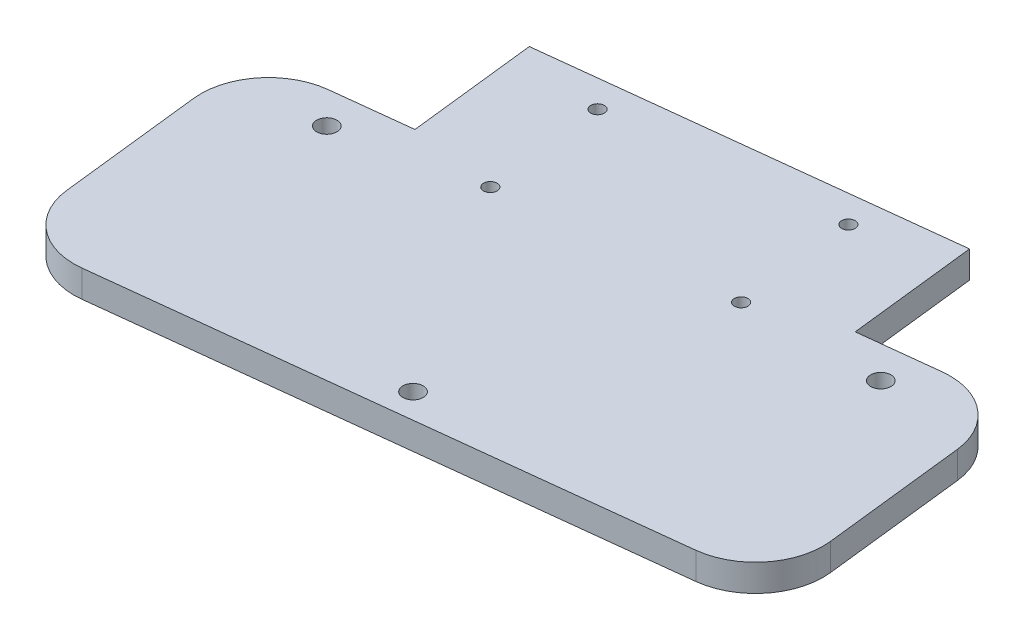
ISO-10303-21;
HEADER;
FILE_DESCRIPTION(('STEP AP214'),'2;1');
FILE_NAME('part.step','',(''),(''),'','','');
FILE_SCHEMA(('AUTOMOTIVE_DESIGN { 1 0 10303 214 1 1 1 1 }'));
ENDSEC;
DATA;
#1=APPLICATION_CONTEXT('core data for automotive mechanical design processes');
#2=APPLICATION_PROTOCOL_DEFINITION('international standard','automotive_design',2000,#1);
#3=PRODUCT_CONTEXT('',#1,'mechanical');
#4=PRODUCT('Part','Part','',(#3));
#5=PRODUCT_RELATED_PRODUCT_CATEGORY('part','',(#4));
#6=PRODUCT_DEFINITION_FORMATION('','',#4);
#7=PRODUCT_DEFINITION_CONTEXT('part definition',#1,'design');
#8=PRODUCT_DEFINITION('design','',#6,#7);
#9=PRODUCT_DEFINITION_SHAPE('','',#8);
#10=(LENGTH_UNIT() NAMED_UNIT(*) SI_UNIT(.MILLI.,.METRE.));
#11=(NAMED_UNIT(*) PLANE_ANGLE_UNIT() SI_UNIT($,.RADIAN.));
#12=(NAMED_UNIT(*) SI_UNIT($,.STERADIAN.) SOLID_ANGLE_UNIT());
#13=UNCERTAINTY_MEASURE_WITH_UNIT(LENGTH_MEASURE(1.E-05),#10,'distance_accuracy_value','');
#14=(GEOMETRIC_REPRESENTATION_CONTEXT(3) GLOBAL_UNCERTAINTY_ASSIGNED_CONTEXT((#13)) GLOBAL_UNIT_ASSIGNED_CONTEXT((#10,
#11,#12)) REPRESENTATION_CONTEXT('',''));
#15=CARTESIAN_POINT('',(0.,0.,0.));
#16=DIRECTION('',(0.,0.,1.));
#17=DIRECTION('',(1.,0.,0.));
#18=AXIS2_PLACEMENT_3D('',#15,#16,#17);
#19=CARTESIAN_POINT('',(0.,4.,0.));
#20=DIRECTION('',(0.,-1.,0.));
#21=DIRECTION('',(0.,0.,-1.));
#22=AXIS2_PLACEMENT_3D('',#19,#20,#21);
#23=PLANE('',#22);
#24=DIRECTION('',(-0.993623352764833,0.,0.112750311930262));
#25=VECTOR('',#24,1.);
#26=CARTESIAN_POINT('',(-43.5958037661953,4.,205.807188303606));
#27=LINE('',#26,#25);
#28=CARTESIAN_POINT('',(-22.1351096812922,4.,203.37195975792));
#29=VERTEX_POINT('',#28);
#30=CARTESIAN_POINT('',(-33.6595702385469,4.,204.679685184303));
#31=VERTEX_POINT('',#30);
#32=EDGE_CURVE('E156',#29,#31,#27,.T.);
#33=ORIENTED_EDGE('',*,*,#32,.T.);
#34=CARTESIAN_POINT('',(-32.5320671192443,4.,214.615918711952));
#35=DIRECTION('',(0.,-1.,0.));
#36=DIRECTION('',(0.,0.,-1.));
#37=AXIS2_PLACEMENT_3D('',#34,#35,#36);
#38=CIRCLE('',#37,10.);
#39=CARTESIAN_POINT('',(-42.4683006468926,4.,215.743421831254));
#40=VERTEX_POINT('',#39);
#41=EDGE_CURVE('E11',#31,#40,#38,.F.);
#42=ORIENTED_EDGE('',*,*,#41,.T.);
#43=DIRECTION('',(0.112750311930262,0.,0.993623352764833));
#44=VECTOR('',#43,1.);
#45=CARTESIAN_POINT('',(-38.93970222805,4.,246.839546812795));
#46=LINE('',#45,#44);
#47=CARTESIAN_POINT('',(-40.0672053473526,4.,236.903313285147));
#48=VERTEX_POINT('',#47);
#49=EDGE_CURVE('E177',#40,#48,#46,.T.);
#50=ORIENTED_EDGE('',*,*,#49,.T.);
#51=CARTESIAN_POINT('',(-30.1309718197043,4.,235.775810165844));
#52=DIRECTION('',(0.,-1.,0.));
#53=DIRECTION('',(0.,0.,-1.));
#54=AXIS2_PLACEMENT_3D('',#51,#52,#53);
#55=CIRCLE('',#54,10.);
#56=CARTESIAN_POINT('',(-29.0034687004016,4.,245.712043693493));
#57=VERTEX_POINT('',#56);
#58=EDGE_CURVE('E192',#48,#57,#55,.F.);
#59=ORIENTED_EDGE('',*,*,#58,.T.);
#60=DIRECTION('',(0.993623352764833,0.,-0.112750311930262));
#61=VECTOR('',#60,1.);
#62=CARTESIAN_POINT('',(62.4098797539631,4.,235.339014995908));
#63=LINE('',#62,#61);
#64=CARTESIAN_POINT('',(52.4736462263148,4.,236.466518115211));
#65=VERTEX_POINT('',#64);
#66=EDGE_CURVE('E229',#57,#65,#63,.T.);
#67=ORIENTED_EDGE('',*,*,#66,.T.);
#68=CARTESIAN_POINT('',(51.3461431070122,4.,226.530284587563));
#69=DIRECTION('',(0.,-1.,0.));
#70=DIRECTION('',(0.,0.,-1.));
#71=AXIS2_PLACEMENT_3D('',#68,#69,#70);
#72=CIRCLE('',#71,10.);
#73=CARTESIAN_POINT('',(61.2823766346605,4.,225.40278146826));
#74=VERTEX_POINT('',#73);
#75=EDGE_CURVE('E201',#65,#74,#72,.F.);
#76=ORIENTED_EDGE('',*,*,#75,.T.);
#77=DIRECTION('',(-0.112750311930261,0.,-0.993623352764834));
#78=VECTOR('',#77,1.);
#79=CARTESIAN_POINT('',(57.7537782158178,4.,194.306656486719));
#80=LINE('',#79,#78);
#81=CARTESIAN_POINT('',(58.8812813351205,4.,204.242890014368));
#82=VERTEX_POINT('',#81);
#83=EDGE_CURVE('E134',#74,#82,#80,.T.);
#84=ORIENTED_EDGE('',*,*,#83,.T.);
#85=CARTESIAN_POINT('',(48.9450478074721,4.,205.37039313367));
#86=DIRECTION('',(0.,-1.,0.));
#87=DIRECTION('',(0.,0.,-1.));
#88=AXIS2_PLACEMENT_3D('',#85,#86,#87);
#89=CIRCLE('',#88,10.);
#90=CARTESIAN_POINT('',(47.8175446881695,4.,195.434159606022));
#91=VERTEX_POINT('',#90);
#92=EDGE_CURVE('E130',#82,#91,#89,.F.);
#93=ORIENTED_EDGE('',*,*,#92,.T.);
#94=DIRECTION('',(-0.993623352764833,0.,0.112750311930262));
#95=VECTOR('',#94,1.);
#96=CARTESIAN_POINT('',(36.2930841309148,4.,196.741885032405));
#97=LINE('',#96,#95);
#98=CARTESIAN_POINT('',(36.2930841309148,4.,196.741885032405));
#99=VERTEX_POINT('',#98);
#100=EDGE_CURVE('E122',#91,#99,#97,.T.);
#101=ORIENTED_EDGE('',*,*,#100,.T.);
#102=DIRECTION('',(-0.112750311930261,0.,-0.993623352764833));
#103=VECTOR('',#102,1.);
#104=CARTESIAN_POINT('',(34.1301854770655,4.,177.681125240826));
#105=LINE('',#104,#103);
#106=CARTESIAN_POINT('',(34.1301854770655,4.,177.681125240826));
#107=VERTEX_POINT('',#106);
#108=EDGE_CURVE('E126',#99,#107,#105,.T.);
#109=ORIENTED_EDGE('',*,*,#108,.T.);
#110=DIRECTION('',(-0.993623352764833,0.,0.112750311930262));
#111=VECTOR('',#110,1.);
#112=CARTESIAN_POINT('',(-24.2980083351415,4.,184.311199966341));
#113=LINE('',#112,#111);
#114=CARTESIAN_POINT('',(-24.2980083351415,4.,184.311199966341));
#115=VERTEX_POINT('',#114);
#116=EDGE_CURVE('E149',#107,#115,#113,.T.);
#117=ORIENTED_EDGE('',*,*,#116,.T.);
#118=DIRECTION('',(0.112750311930262,0.,0.993623352764834));
#119=VECTOR('',#118,1.);
#120=CARTESIAN_POINT('',(-22.1351096812922,4.,203.37195975792));
#121=LINE('',#120,#119);
#122=EDGE_CURVE('E151',#115,#29,#121,.T.);
#123=ORIENTED_EDGE('',*,*,#122,.T.);
#124=EDGE_LOOP('',(#33,#42,#50,#59,#67,#76,#84,#93,#101,#109,#117,#123));
#125=FACE_BOUND('',#124,.T.);
#126=CARTESIAN_POINT('',(-29.0931407132156,4.,209.44517989492));
#127=DIRECTION('',(0.,1.,0.));
#128=DIRECTION('',(0.,0.,1.));
#129=AXIS2_PLACEMENT_3D('',#126,#127,#128);
#130=CIRCLE('',#129,1.5);
#131=CARTESIAN_POINT('',(-29.0931407132156,4.,210.94517989492));
#132=VERTEX_POINT('',#131);
#133=EDGE_CURVE('E162',#132,#132,#130,.T.);
#134=ORIENTED_EDGE('',*,*,#133,.F.);
#135=EDGE_LOOP('',(#134));
#136=FACE_BOUND('',#135,.T.);
#137=CARTESIAN_POINT('',(44.4349873913821,4.,201.101656812081));
#138=DIRECTION('',(0.,1.,0.));
#139=DIRECTION('',(0.,0.,-1.));
#140=AXIS2_PLACEMENT_3D('',#137,#138,#139);
#141=CIRCLE('',#140,1.5);
#142=CARTESIAN_POINT('',(44.4349873913821,4.,199.601656812081));
#143=VERTEX_POINT('',#142);
#144=EDGE_CURVE('E240',#143,#143,#141,.T.);
#145=ORIENTED_EDGE('',*,*,#144,.F.);
#146=EDGE_LOOP('',(#145));
#147=FACE_BOUND('',#146,.T.);
#148=CARTESIAN_POINT('',(11.2789333208517,4.,237.069365641975));
#149=DIRECTION('',(0.,1.,0.));
#150=DIRECTION('',(0.,0.,1.));
#151=AXIS2_PLACEMENT_3D('',#148,#149,#150);
#152=CIRCLE('',#151,1.5);
#153=CARTESIAN_POINT('',(11.2789333208517,4.,238.569365641975));
#154=VERTEX_POINT('',#153);
#155=EDGE_CURVE('E246',#154,#154,#152,.T.);
#156=ORIENTED_EDGE('',*,*,#155,.F.);
#157=EDGE_LOOP('',(#156));
#158=FACE_BOUND('',#157,.T.);
#159=CARTESIAN_POINT('',(-9.19776844358822,4.,205.174739372802));
#160=DIRECTION('',(0.,1.,0.));
#161=DIRECTION('',(0.,0.,1.));
#162=AXIS2_PLACEMENT_3D('',#159,#160,#161);
#163=CIRCLE('',#162,1.);
#164=CARTESIAN_POINT('',(-9.19776844358822,4.,206.174739372802));
#165=VERTEX_POINT('',#164);
#166=EDGE_CURVE('E252',#165,#165,#163,.T.);
#167=ORIENTED_EDGE('',*,*,#166,.F.);
#168=EDGE_LOOP('',(#167));
#169=FACE_BOUND('',#168,.T.);
#170=CARTESIAN_POINT('',(-11.2267660300873,4.,187.293996072545));
#171=DIRECTION('',(0.,1.,0.));
#172=DIRECTION('',(0.,0.,1.));
#173=AXIS2_PLACEMENT_3D('',#170,#171,#172);
#174=CIRCLE('',#173,1.);
#175=CARTESIAN_POINT('',(-11.2267660300873,4.,188.293996072545));
#176=VERTEX_POINT('',#175);
#177=EDGE_CURVE('E258',#176,#176,#174,.T.);
#178=ORIENTED_EDGE('',*,*,#177,.F.);
#179=EDGE_LOOP('',(#178));
#180=FACE_BOUND('',#179,.T.);
#181=CARTESIAN_POINT('',(22.0596162875347,4.,183.516860622882));
#182=DIRECTION('',(0.,1.,0.));
#183=DIRECTION('',(0.,0.,1.));
#184=AXIS2_PLACEMENT_3D('',#181,#182,#183);
#185=CIRCLE('',#184,0.999999999999992);
#186=CARTESIAN_POINT('',(22.0596162875347,4.,184.516860622882));
#187=VERTEX_POINT('',#186);
#188=EDGE_CURVE('E264',#187,#187,#185,.T.);
#189=ORIENTED_EDGE('',*,*,#188,.F.);
#190=EDGE_LOOP('',(#189));
#191=FACE_BOUND('',#190,.T.);
#192=CARTESIAN_POINT('',(24.0886138740337,4.,201.397603923139));
#193=DIRECTION('',(0.,1.,0.));
#194=DIRECTION('',(0.,0.,1.));
#195=AXIS2_PLACEMENT_3D('',#192,#193,#194);
#196=CIRCLE('',#195,0.999999999999992);
#197=CARTESIAN_POINT('',(24.0886138740337,4.,202.397603923139));
#198=VERTEX_POINT('',#197);
#199=EDGE_CURVE('E270',#198,#198,#196,.T.);
#200=ORIENTED_EDGE('',*,*,#199,.F.);
#201=EDGE_LOOP('',(#200));
#202=FACE_BOUND('',#201,.T.);
#203=ADVANCED_FACE('F34',(#125,#136,#147,#158,#169,#180,#191,#202),#23,.F.);
#204=CARTESIAN_POINT('',(0.,0.,0.));
#205=DIRECTION('',(0.,-1.,0.));
#206=DIRECTION('',(0.,0.,-1.));
#207=AXIS2_PLACEMENT_3D('',#204,#205,#206);
#208=PLANE('',#207);
#209=CARTESIAN_POINT('',(22.0596162875347,0.,183.516860622882));
#210=DIRECTION('',(0.,1.,0.));
#211=DIRECTION('',(0.,0.,1.));
#212=AXIS2_PLACEMENT_3D('',#209,#210,#211);
#213=CIRCLE('',#212,0.999999999999992);
#214=CARTESIAN_POINT('',(22.0596162875347,0.,184.516860622882));
#215=VERTEX_POINT('',#214);
#216=EDGE_CURVE('E267',#215,#215,#213,.T.);
#217=ORIENTED_EDGE('',*,*,#216,.T.);
#218=EDGE_LOOP('',(#217));
#219=FACE_BOUND('',#218,.T.);
#220=CARTESIAN_POINT('',(-9.19776844358822,0.,205.174739372802));
#221=DIRECTION('',(0.,1.,0.));
#222=DIRECTION('',(0.,0.,1.));
#223=AXIS2_PLACEMENT_3D('',#220,#221,#222);
#224=CIRCLE('',#223,1.);
#225=CARTESIAN_POINT('',(-9.19776844358822,0.,206.174739372802));
#226=VERTEX_POINT('',#225);
#227=EDGE_CURVE('E255',#226,#226,#224,.T.);
#228=ORIENTED_EDGE('',*,*,#227,.T.);
#229=EDGE_LOOP('',(#228));
#230=FACE_BOUND('',#229,.T.);
#231=CARTESIAN_POINT('',(44.4349873913821,0.,201.101656812081));
#232=DIRECTION('',(0.,1.,0.));
#233=DIRECTION('',(0.,0.,-1.));
#234=AXIS2_PLACEMENT_3D('',#231,#232,#233);
#235=CIRCLE('',#234,1.5);
#236=CARTESIAN_POINT('',(44.4349873913821,0.,199.601656812081));
#237=VERTEX_POINT('',#236);
#238=EDGE_CURVE('E243',#237,#237,#235,.T.);
#239=ORIENTED_EDGE('',*,*,#238,.T.);
#240=EDGE_LOOP('',(#239));
#241=FACE_BOUND('',#240,.T.);
#242=DIRECTION('',(0.112750311930262,0.,0.993623352764833));
#243=VECTOR('',#242,1.);
#244=CARTESIAN_POINT('',(-38.93970222805,0.,246.839546812795));
#245=LINE('',#244,#243);
#246=CARTESIAN_POINT('',(-42.4683006468926,0.,215.743421831254));
#247=VERTEX_POINT('',#246);
#248=CARTESIAN_POINT('',(-40.0672053473526,0.,236.903313285147));
#249=VERTEX_POINT('',#248);
#250=EDGE_CURVE('E159',#247,#249,#245,.T.);
#251=ORIENTED_EDGE('',*,*,#250,.F.);
#252=CARTESIAN_POINT('',(-32.5320671192443,0.,214.615918711952));
#253=DIRECTION('',(0.,-1.,0.));
#254=DIRECTION('',(0.,0.,-1.));
#255=AXIS2_PLACEMENT_3D('',#252,#253,#254);
#256=CIRCLE('',#255,10.);
#257=CARTESIAN_POINT('',(-33.6595702385469,0.,204.679685184303));
#258=VERTEX_POINT('',#257);
#259=EDGE_CURVE('E56',#247,#258,#256,.T.);
#260=ORIENTED_EDGE('',*,*,#259,.T.);
#261=DIRECTION('',(-0.993623352764833,0.,0.112750311930262));
#262=VECTOR('',#261,1.);
#263=CARTESIAN_POINT('',(-43.5958037661953,0.,205.807188303606));
#264=LINE('',#263,#262);
#265=CARTESIAN_POINT('',(-22.1351096812922,0.,203.37195975792));
#266=VERTEX_POINT('',#265);
#267=EDGE_CURVE('E175',#266,#258,#264,.T.);
#268=ORIENTED_EDGE('',*,*,#267,.F.);
#269=DIRECTION('',(0.112750311930262,0.,0.993623352764834));
#270=VECTOR('',#269,1.);
#271=CARTESIAN_POINT('',(-22.1351096812922,0.,203.37195975792));
#272=LINE('',#271,#270);
#273=CARTESIAN_POINT('',(-24.2980083351415,0.,184.311199966341));
#274=VERTEX_POINT('',#273);
#275=EDGE_CURVE('E173',#274,#266,#272,.T.);
#276=ORIENTED_EDGE('',*,*,#275,.F.);
#277=DIRECTION('',(-0.993623352764833,0.,0.112750311930262));
#278=VECTOR('',#277,1.);
#279=CARTESIAN_POINT('',(-24.2980083351415,0.,184.311199966341));
#280=LINE('',#279,#278);
#281=CARTESIAN_POINT('',(34.1301854770655,0.,177.681125240826));
#282=VERTEX_POINT('',#281);
#283=EDGE_CURVE('E171',#282,#274,#280,.T.);
#284=ORIENTED_EDGE('',*,*,#283,.F.);
#285=DIRECTION('',(-0.112750311930261,0.,-0.993623352764833));
#286=VECTOR('',#285,1.);
#287=CARTESIAN_POINT('',(34.1301854770655,0.,177.681125240826));
#288=LINE('',#287,#286);
#289=CARTESIAN_POINT('',(36.2930841309148,0.,196.741885032405));
#290=VERTEX_POINT('',#289);
#291=EDGE_CURVE('E169',#290,#282,#288,.T.);
#292=ORIENTED_EDGE('',*,*,#291,.F.);
#293=DIRECTION('',(-0.993623352764833,0.,0.112750311930262));
#294=VECTOR('',#293,1.);
#295=CARTESIAN_POINT('',(36.2930841309148,0.,196.741885032405));
#296=LINE('',#295,#294);
#297=CARTESIAN_POINT('',(47.8175446881695,0.,195.434159606022));
#298=VERTEX_POINT('',#297);
#299=EDGE_CURVE('E140',#298,#290,#296,.T.);
#300=ORIENTED_EDGE('',*,*,#299,.F.);
#301=CARTESIAN_POINT('',(48.9450478074721,0.,205.37039313367));
#302=DIRECTION('',(0.,-1.,0.));
#303=DIRECTION('',(0.,0.,-1.));
#304=AXIS2_PLACEMENT_3D('',#301,#302,#303);
#305=CIRCLE('',#304,10.);
#306=CARTESIAN_POINT('',(58.8812813351205,0.,204.242890014368));
#307=VERTEX_POINT('',#306);
#308=EDGE_CURVE('E205',#298,#307,#305,.T.);
#309=ORIENTED_EDGE('',*,*,#308,.T.);
#310=DIRECTION('',(-0.112750311930261,0.,-0.993623352764834));
#311=VECTOR('',#310,1.);
#312=CARTESIAN_POINT('',(57.7537782158178,0.,194.306656486719));
#313=LINE('',#312,#311);
#314=CARTESIAN_POINT('',(61.2823766346605,0.,225.40278146826));
#315=VERTEX_POINT('',#314);
#316=EDGE_CURVE('E165',#315,#307,#313,.T.);
#317=ORIENTED_EDGE('',*,*,#316,.F.);
#318=CARTESIAN_POINT('',(51.3461431070122,0.,226.530284587563));
#319=DIRECTION('',(0.,-1.,0.));
#320=DIRECTION('',(0.,0.,-1.));
#321=AXIS2_PLACEMENT_3D('',#318,#319,#320);
#322=CIRCLE('',#321,10.);
#323=CARTESIAN_POINT('',(52.4736462263148,0.,236.466518115211));
#324=VERTEX_POINT('',#323);
#325=EDGE_CURVE('E197',#315,#324,#322,.T.);
#326=ORIENTED_EDGE('',*,*,#325,.T.);
#327=DIRECTION('',(0.993623352764833,0.,-0.112750311930262));
#328=VECTOR('',#327,1.);
#329=CARTESIAN_POINT('',(62.4098797539631,0.,235.339014995908));
#330=LINE('',#329,#328);
#331=CARTESIAN_POINT('',(-29.0034687004016,0.,245.712043693493));
#332=VERTEX_POINT('',#331);
#333=EDGE_CURVE('E161',#332,#324,#330,.T.);
#334=ORIENTED_EDGE('',*,*,#333,.F.);
#335=CARTESIAN_POINT('',(-30.1309718197043,0.,235.775810165844));
#336=DIRECTION('',(0.,-1.,0.));
#337=DIRECTION('',(0.,0.,-1.));
#338=AXIS2_PLACEMENT_3D('',#335,#336,#337);
#339=CIRCLE('',#338,10.);
#340=EDGE_CURVE('E186',#332,#249,#339,.T.);
#341=ORIENTED_EDGE('',*,*,#340,.T.);
#342=EDGE_LOOP('',(#251,#260,#268,#276,#284,#292,#300,#309,#317,#326,#334,#341));
#343=FACE_BOUND('',#342,.T.);
#344=CARTESIAN_POINT('',(-29.0931407132156,0.,209.44517989492));
#345=DIRECTION('',(0.,1.,0.));
#346=DIRECTION('',(0.,0.,1.));
#347=AXIS2_PLACEMENT_3D('',#344,#345,#346);
#348=CIRCLE('',#347,1.5);
#349=CARTESIAN_POINT('',(-29.0931407132156,0.,210.94517989492));
#350=VERTEX_POINT('',#349);
#351=EDGE_CURVE('E237',#350,#350,#348,.T.);
#352=ORIENTED_EDGE('',*,*,#351,.T.);
#353=EDGE_LOOP('',(#352));
#354=FACE_BOUND('',#353,.T.);
#355=CARTESIAN_POINT('',(11.2789333208517,0.,237.069365641975));
#356=DIRECTION('',(0.,1.,0.));
#357=DIRECTION('',(0.,0.,1.));
#358=AXIS2_PLACEMENT_3D('',#355,#356,#357);
#359=CIRCLE('',#358,1.5);
#360=CARTESIAN_POINT('',(11.2789333208517,0.,238.569365641975));
#361=VERTEX_POINT('',#360);
#362=EDGE_CURVE('E249',#361,#361,#359,.T.);
#363=ORIENTED_EDGE('',*,*,#362,.T.);
#364=EDGE_LOOP('',(#363));
#365=FACE_BOUND('',#364,.T.);
#366=CARTESIAN_POINT('',(-11.2267660300873,0.,187.293996072545));
#367=DIRECTION('',(0.,1.,0.));
#368=DIRECTION('',(0.,0.,1.));
#369=AXIS2_PLACEMENT_3D('',#366,#367,#368);
#370=CIRCLE('',#369,1.);
#371=CARTESIAN_POINT('',(-11.2267660300873,0.,188.293996072545));
#372=VERTEX_POINT('',#371);
#373=EDGE_CURVE('E261',#372,#372,#370,.T.);
#374=ORIENTED_EDGE('',*,*,#373,.T.);
#375=EDGE_LOOP('',(#374));
#376=FACE_BOUND('',#375,.T.);
#377=CARTESIAN_POINT('',(24.0886138740337,0.,201.397603923139));
#378=DIRECTION('',(0.,1.,0.));
#379=DIRECTION('',(0.,0.,1.));
#380=AXIS2_PLACEMENT_3D('',#377,#378,#379);
#381=CIRCLE('',#380,0.999999999999992);
#382=CARTESIAN_POINT('',(24.0886138740337,0.,202.397603923139));
#383=VERTEX_POINT('',#382);
#384=EDGE_CURVE('E273',#383,#383,#381,.T.);
#385=ORIENTED_EDGE('',*,*,#384,.T.);
#386=EDGE_LOOP('',(#385));
#387=FACE_BOUND('',#386,.T.);
#388=ADVANCED_FACE('F219',(#219,#230,#241,#343,#354,#365,#376,#387),#208,.T.);
#389=CARTESIAN_POINT('',(-38.93970222805,4.,246.839546812795));
#390=DIRECTION('',(0.993623352764833,0.,-0.112750311930262));
#391=DIRECTION('',(-0.112750311930262,0.,-0.993623352764833));
#392=AXIS2_PLACEMENT_3D('',#389,#390,#391);
#393=PLANE('',#392);
#394=ORIENTED_EDGE('',*,*,#49,.F.);
#395=DIRECTION('',(0.,-1.,0.));
#396=VECTOR('',#395,1.);
#397=CARTESIAN_POINT('',(-42.4683006468926,4.,215.743421831254));
#398=LINE('',#397,#396);
#399=EDGE_CURVE('E210',#40,#247,#398,.T.);
#400=ORIENTED_EDGE('',*,*,#399,.T.);
#401=ORIENTED_EDGE('',*,*,#250,.T.);
#402=DIRECTION('',(0.,-1.,0.));
#403=VECTOR('',#402,1.);
#404=CARTESIAN_POINT('',(-40.0672053473526,4.,236.903313285147));
#405=LINE('',#404,#403);
#406=EDGE_CURVE('E189',#249,#48,#405,.F.);
#407=ORIENTED_EDGE('',*,*,#406,.T.);
#408=EDGE_LOOP('',(#394,#400,#401,#407));
#409=FACE_BOUND('',#408,.T.);
#410=ADVANCED_FACE('F216',(#409),#393,.F.);
#411=CARTESIAN_POINT('',(62.4098797539631,4.,235.339014995908));
#412=DIRECTION('',(-0.112750311930262,0.,-0.993623352764833));
#413=DIRECTION('',(-0.993623352764833,0.,0.112750311930262));
#414=AXIS2_PLACEMENT_3D('',#411,#412,#413);
#415=PLANE('',#414);
#416=ORIENTED_EDGE('',*,*,#333,.T.);
#417=DIRECTION('',(0.,-1.,0.));
#418=VECTOR('',#417,1.);
#419=CARTESIAN_POINT('',(52.4736462263148,4.,236.466518115211));
#420=LINE('',#419,#418);
#421=EDGE_CURVE('E199',#324,#65,#420,.F.);
#422=ORIENTED_EDGE('',*,*,#421,.T.);
#423=ORIENTED_EDGE('',*,*,#66,.F.);
#424=DIRECTION('',(0.,-1.,0.));
#425=VECTOR('',#424,1.);
#426=CARTESIAN_POINT('',(-29.0034687004016,4.,245.712043693493));
#427=LINE('',#426,#425);
#428=EDGE_CURVE('E143',#57,#332,#427,.T.);
#429=ORIENTED_EDGE('',*,*,#428,.T.);
#430=EDGE_LOOP('',(#416,#422,#423,#429));
#431=FACE_BOUND('',#430,.T.);
#432=ADVANCED_FACE('F232',(#431),#415,.F.);
#433=CARTESIAN_POINT('',(57.7537782158178,4.,194.306656486719));
#434=DIRECTION('',(-0.993623352764833,0.,0.112750311930261));
#435=DIRECTION('',(0.112750311930261,0.,0.993623352764834));
#436=AXIS2_PLACEMENT_3D('',#433,#434,#435);
#437=PLANE('',#436);
#438=ORIENTED_EDGE('',*,*,#316,.T.);
#439=DIRECTION('',(0.,-1.,0.));
#440=VECTOR('',#439,1.);
#441=CARTESIAN_POINT('',(58.8812813351205,4.,204.242890014368));
#442=LINE('',#441,#440);
#443=EDGE_CURVE('E207',#307,#82,#442,.F.);
#444=ORIENTED_EDGE('',*,*,#443,.T.);
#445=ORIENTED_EDGE('',*,*,#83,.F.);
#446=DIRECTION('',(0.,-1.,0.));
#447=VECTOR('',#446,1.);
#448=CARTESIAN_POINT('',(61.2823766346605,4.,225.40278146826));
#449=LINE('',#448,#447);
#450=EDGE_CURVE('E194',#74,#315,#449,.T.);
#451=ORIENTED_EDGE('',*,*,#450,.T.);
#452=EDGE_LOOP('',(#438,#444,#445,#451));
#453=FACE_BOUND('',#452,.T.);
#454=ADVANCED_FACE('F308',(#453),#437,.F.);
#455=CARTESIAN_POINT('',(36.2930841309148,4.,196.741885032405));
#456=DIRECTION('',(0.112750311930262,0.,0.993623352764833));
#457=DIRECTION('',(0.993623352764833,0.,-0.112750311930262));
#458=AXIS2_PLACEMENT_3D('',#455,#456,#457);
#459=PLANE('',#458);
#460=ORIENTED_EDGE('',*,*,#100,.F.);
#461=DIRECTION('',(0.,-1.,0.));
#462=VECTOR('',#461,1.);
#463=CARTESIAN_POINT('',(47.8175446881695,4.,195.434159606022));
#464=LINE('',#463,#462);
#465=EDGE_CURVE('E203',#91,#298,#464,.T.);
#466=ORIENTED_EDGE('',*,*,#465,.T.);
#467=ORIENTED_EDGE('',*,*,#299,.T.);
#468=DIRECTION('',(0.,-1.,0.));
#469=VECTOR('',#468,1.);
#470=CARTESIAN_POINT('',(36.2930841309148,4.,196.741885032405));
#471=LINE('',#470,#469);
#472=EDGE_CURVE('E137',#99,#290,#471,.T.);
#473=ORIENTED_EDGE('',*,*,#472,.F.);
#474=EDGE_LOOP('',(#460,#466,#467,#473));
#475=FACE_BOUND('',#474,.T.);
#476=ADVANCED_FACE('F138',(#475),#459,.F.);
#477=CARTESIAN_POINT('',(34.1301854770655,4.,177.681125240826));
#478=DIRECTION('',(-0.993623352764834,0.,0.112750311930261));
#479=DIRECTION('',(0.112750311930261,0.,0.993623352764834));
#480=AXIS2_PLACEMENT_3D('',#477,#478,#479);
#481=PLANE('',#480);
#482=ORIENTED_EDGE('',*,*,#291,.T.);
#483=DIRECTION('',(0.,-1.,0.));
#484=VECTOR('',#483,1.);
#485=CARTESIAN_POINT('',(34.1301854770655,4.,177.681125240826));
#486=LINE('',#485,#484);
#487=EDGE_CURVE('E144',#107,#282,#486,.T.);
#488=ORIENTED_EDGE('',*,*,#487,.F.);
#489=ORIENTED_EDGE('',*,*,#108,.F.);
#490=ORIENTED_EDGE('',*,*,#472,.T.);
#491=EDGE_LOOP('',(#482,#488,#489,#490));
#492=FACE_BOUND('',#491,.T.);
#493=ADVANCED_FACE('F146',(#492),#481,.F.);
#494=CARTESIAN_POINT('',(-24.2980083351415,4.,184.311199966341));
#495=DIRECTION('',(0.112750311930262,0.,0.993623352764833));
#496=DIRECTION('',(0.993623352764833,0.,-0.112750311930262));
#497=AXIS2_PLACEMENT_3D('',#494,#495,#496);
#498=PLANE('',#497);
#499=ORIENTED_EDGE('',*,*,#283,.T.);
#500=DIRECTION('',(0.,-1.,0.));
#501=VECTOR('',#500,1.);
#502=CARTESIAN_POINT('',(-24.2980083351415,4.,184.311199966341));
#503=LINE('',#502,#501);
#504=EDGE_CURVE('E180',#115,#274,#503,.T.);
#505=ORIENTED_EDGE('',*,*,#504,.F.);
#506=ORIENTED_EDGE('',*,*,#116,.F.);
#507=ORIENTED_EDGE('',*,*,#487,.T.);
#508=EDGE_LOOP('',(#499,#505,#506,#507));
#509=FACE_BOUND('',#508,.T.);
#510=ADVANCED_FACE('F299',(#509),#498,.F.);
#511=CARTESIAN_POINT('',(-22.1351096812922,4.,203.37195975792));
#512=DIRECTION('',(0.993623352764833,0.,-0.112750311930262));
#513=DIRECTION('',(-0.112750311930262,0.,-0.993623352764833));
#514=AXIS2_PLACEMENT_3D('',#511,#512,#513);
#515=PLANE('',#514);
#516=ORIENTED_EDGE('',*,*,#275,.T.);
#517=DIRECTION('',(0.,-1.,0.));
#518=VECTOR('',#517,1.);
#519=CARTESIAN_POINT('',(-22.1351096812922,4.,203.37195975792));
#520=LINE('',#519,#518);
#521=EDGE_CURVE('E158',#29,#266,#520,.T.);
#522=ORIENTED_EDGE('',*,*,#521,.F.);
#523=ORIENTED_EDGE('',*,*,#122,.F.);
#524=ORIENTED_EDGE('',*,*,#504,.T.);
#525=EDGE_LOOP('',(#516,#522,#523,#524));
#526=FACE_BOUND('',#525,.T.);
#527=ADVANCED_FACE('F296',(#526),#515,.F.);
#528=CARTESIAN_POINT('',(-43.5958037661953,4.,205.807188303606));
#529=DIRECTION('',(0.112750311930262,0.,0.993623352764833));
#530=DIRECTION('',(0.993623352764833,0.,-0.112750311930262));
#531=AXIS2_PLACEMENT_3D('',#528,#529,#530);
#532=PLANE('',#531);
#533=ORIENTED_EDGE('',*,*,#267,.T.);
#534=DIRECTION('',(0.,-1.,0.));
#535=VECTOR('',#534,1.);
#536=CARTESIAN_POINT('',(-33.6595702385469,4.,204.679685184303));
#537=LINE('',#536,#535);
#538=EDGE_CURVE('E42',#258,#31,#537,.F.);
#539=ORIENTED_EDGE('',*,*,#538,.T.);
#540=ORIENTED_EDGE('',*,*,#32,.F.);
#541=ORIENTED_EDGE('',*,*,#521,.T.);
#542=EDGE_LOOP('',(#533,#539,#540,#541));
#543=FACE_BOUND('',#542,.T.);
#544=ADVANCED_FACE('F293',(#543),#532,.F.);
#545=CARTESIAN_POINT('',(-29.0931407132156,4.,209.44517989492));
#546=DIRECTION('',(0.,-1.,0.));
#547=DIRECTION('',(0.,0.,-1.));
#548=AXIS2_PLACEMENT_3D('',#545,#546,#547);
#549=CYLINDRICAL_SURFACE('',#548,1.5);
#550=ORIENTED_EDGE('',*,*,#133,.T.);
#551=EDGE_LOOP('',(#550));
#552=FACE_BOUND('',#551,.T.);
#553=ORIENTED_EDGE('',*,*,#351,.F.);
#554=EDGE_LOOP('',(#553));
#555=FACE_BOUND('',#554,.T.);
#556=ADVANCED_FACE('F290',(#552,#555),#549,.F.);
#557=CARTESIAN_POINT('',(44.4349873913821,4.,201.101656812081));
#558=DIRECTION('',(0.,-1.,0.));
#559=DIRECTION('',(0.,0.,-1.));
#560=AXIS2_PLACEMENT_3D('',#557,#558,#559);
#561=CYLINDRICAL_SURFACE('',#560,1.5);
#562=ORIENTED_EDGE('',*,*,#144,.T.);
#563=EDGE_LOOP('',(#562));
#564=FACE_BOUND('',#563,.T.);
#565=ORIENTED_EDGE('',*,*,#238,.F.);
#566=EDGE_LOOP('',(#565));
#567=FACE_BOUND('',#566,.T.);
#568=ADVANCED_FACE('F446',(#564,#567),#561,.F.);
#569=CARTESIAN_POINT('',(11.2789333208517,4.,237.069365641975));
#570=DIRECTION('',(0.,-1.,0.));
#571=DIRECTION('',(0.,0.,-1.));
#572=AXIS2_PLACEMENT_3D('',#569,#570,#571);
#573=CYLINDRICAL_SURFACE('',#572,1.5);
#574=ORIENTED_EDGE('',*,*,#155,.T.);
#575=EDGE_LOOP('',(#574));
#576=FACE_BOUND('',#575,.T.);
#577=ORIENTED_EDGE('',*,*,#362,.F.);
#578=EDGE_LOOP('',(#577));
#579=FACE_BOUND('',#578,.T.);
#580=ADVANCED_FACE('F436',(#576,#579),#573,.F.);
#581=CARTESIAN_POINT('',(-9.19776844358822,4.,205.174739372802));
#582=DIRECTION('',(0.,-1.,0.));
#583=DIRECTION('',(0.,0.,-1.));
#584=AXIS2_PLACEMENT_3D('',#581,#582,#583);
#585=CYLINDRICAL_SURFACE('',#584,1.);
#586=ORIENTED_EDGE('',*,*,#166,.T.);
#587=EDGE_LOOP('',(#586));
#588=FACE_BOUND('',#587,.T.);
#589=ORIENTED_EDGE('',*,*,#227,.F.);
#590=EDGE_LOOP('',(#589));
#591=FACE_BOUND('',#590,.T.);
#592=ADVANCED_FACE('F426',(#588,#591),#585,.F.);
#593=CARTESIAN_POINT('',(-11.2267660300873,4.,187.293996072545));
#594=DIRECTION('',(0.,-1.,0.));
#595=DIRECTION('',(0.,0.,-1.));
#596=AXIS2_PLACEMENT_3D('',#593,#594,#595);
#597=CYLINDRICAL_SURFACE('',#596,1.);
#598=ORIENTED_EDGE('',*,*,#177,.T.);
#599=EDGE_LOOP('',(#598));
#600=FACE_BOUND('',#599,.T.);
#601=ORIENTED_EDGE('',*,*,#373,.F.);
#602=EDGE_LOOP('',(#601));
#603=FACE_BOUND('',#602,.T.);
#604=ADVANCED_FACE('F416',(#600,#603),#597,.F.);
#605=CARTESIAN_POINT('',(22.0596162875347,4.,183.516860622882));
#606=DIRECTION('',(0.,-1.,0.));
#607=DIRECTION('',(0.,0.,-1.));
#608=AXIS2_PLACEMENT_3D('',#605,#606,#607);
#609=CYLINDRICAL_SURFACE('',#608,0.999999999999992);
#610=ORIENTED_EDGE('',*,*,#188,.T.);
#611=EDGE_LOOP('',(#610));
#612=FACE_BOUND('',#611,.T.);
#613=ORIENTED_EDGE('',*,*,#216,.F.);
#614=EDGE_LOOP('',(#613));
#615=FACE_BOUND('',#614,.T.);
#616=ADVANCED_FACE('F407',(#612,#615),#609,.F.);
#617=CARTESIAN_POINT('',(24.0886138740337,4.,201.397603923139));
#618=DIRECTION('',(0.,-1.,0.));
#619=DIRECTION('',(0.,0.,-1.));
#620=AXIS2_PLACEMENT_3D('',#617,#618,#619);
#621=CYLINDRICAL_SURFACE('',#620,0.999999999999992);
#622=ORIENTED_EDGE('',*,*,#199,.T.);
#623=EDGE_LOOP('',(#622));
#624=FACE_BOUND('',#623,.T.);
#625=ORIENTED_EDGE('',*,*,#384,.F.);
#626=EDGE_LOOP('',(#625));
#627=FACE_BOUND('',#626,.T.);
#628=ADVANCED_FACE('F279',(#624,#627),#621,.F.);
#629=CARTESIAN_POINT('',(-30.1309718197043,4.,235.775810165844));
#630=DIRECTION('',(0.,-1.,0.));
#631=DIRECTION('',(0.,0.,-1.));
#632=AXIS2_PLACEMENT_3D('',#629,#630,#631);
#633=CYLINDRICAL_SURFACE('',#632,10.);
#634=ORIENTED_EDGE('',*,*,#58,.F.);
#635=ORIENTED_EDGE('',*,*,#406,.F.);
#636=ORIENTED_EDGE('',*,*,#340,.F.);
#637=ORIENTED_EDGE('',*,*,#428,.F.);
#638=EDGE_LOOP('',(#634,#635,#636,#637));
#639=FACE_BOUND('',#638,.T.);
#640=ADVANCED_FACE('F226',(#639),#633,.T.);
#641=CARTESIAN_POINT('',(51.3461431070122,4.,226.530284587563));
#642=DIRECTION('',(0.,-1.,0.));
#643=DIRECTION('',(0.,0.,-1.));
#644=AXIS2_PLACEMENT_3D('',#641,#642,#643);
#645=CYLINDRICAL_SURFACE('',#644,10.);
#646=ORIENTED_EDGE('',*,*,#75,.F.);
#647=ORIENTED_EDGE('',*,*,#421,.F.);
#648=ORIENTED_EDGE('',*,*,#325,.F.);
#649=ORIENTED_EDGE('',*,*,#450,.F.);
#650=EDGE_LOOP('',(#646,#647,#648,#649));
#651=FACE_BOUND('',#650,.T.);
#652=ADVANCED_FACE('F318',(#651),#645,.T.);
#653=CARTESIAN_POINT('',(48.9450478074721,4.,205.37039313367));
#654=DIRECTION('',(0.,-1.,0.));
#655=DIRECTION('',(0.,0.,-1.));
#656=AXIS2_PLACEMENT_3D('',#653,#654,#655);
#657=CYLINDRICAL_SURFACE('',#656,10.);
#658=ORIENTED_EDGE('',*,*,#92,.F.);
#659=ORIENTED_EDGE('',*,*,#443,.F.);
#660=ORIENTED_EDGE('',*,*,#308,.F.);
#661=ORIENTED_EDGE('',*,*,#465,.F.);
#662=EDGE_LOOP('',(#658,#659,#660,#661));
#663=FACE_BOUND('',#662,.T.);
#664=ADVANCED_FACE('F320',(#663),#657,.T.);
#665=CARTESIAN_POINT('',(-32.5320671192443,4.,214.615918711952));
#666=DIRECTION('',(0.,-1.,0.));
#667=DIRECTION('',(0.,0.,-1.));
#668=AXIS2_PLACEMENT_3D('',#665,#666,#667);
#669=CYLINDRICAL_SURFACE('',#668,10.);
#670=ORIENTED_EDGE('',*,*,#41,.F.);
#671=ORIENTED_EDGE('',*,*,#538,.F.);
#672=ORIENTED_EDGE('',*,*,#259,.F.);
#673=ORIENTED_EDGE('',*,*,#399,.F.);
#674=EDGE_LOOP('',(#670,#671,#672,#673));
#675=FACE_BOUND('',#674,.T.);
#676=ADVANCED_FACE('F36',(#675),#669,.T.);
#677=CLOSED_SHELL('',(#203,#388,#410,#432,#454,#476,#493,#510,#527,#544,#556,#568,#580,#592,
#604,#616,#628,#640,#652,#664,#676));
#678=MANIFOLD_SOLID_BREP('B2',#677);
#679=ADVANCED_BREP_SHAPE_REPRESENTATION('',(#18,#678),#14);
#680=SHAPE_DEFINITION_REPRESENTATION(#9,#679);
ENDSEC;
END-ISO-10303-21;
